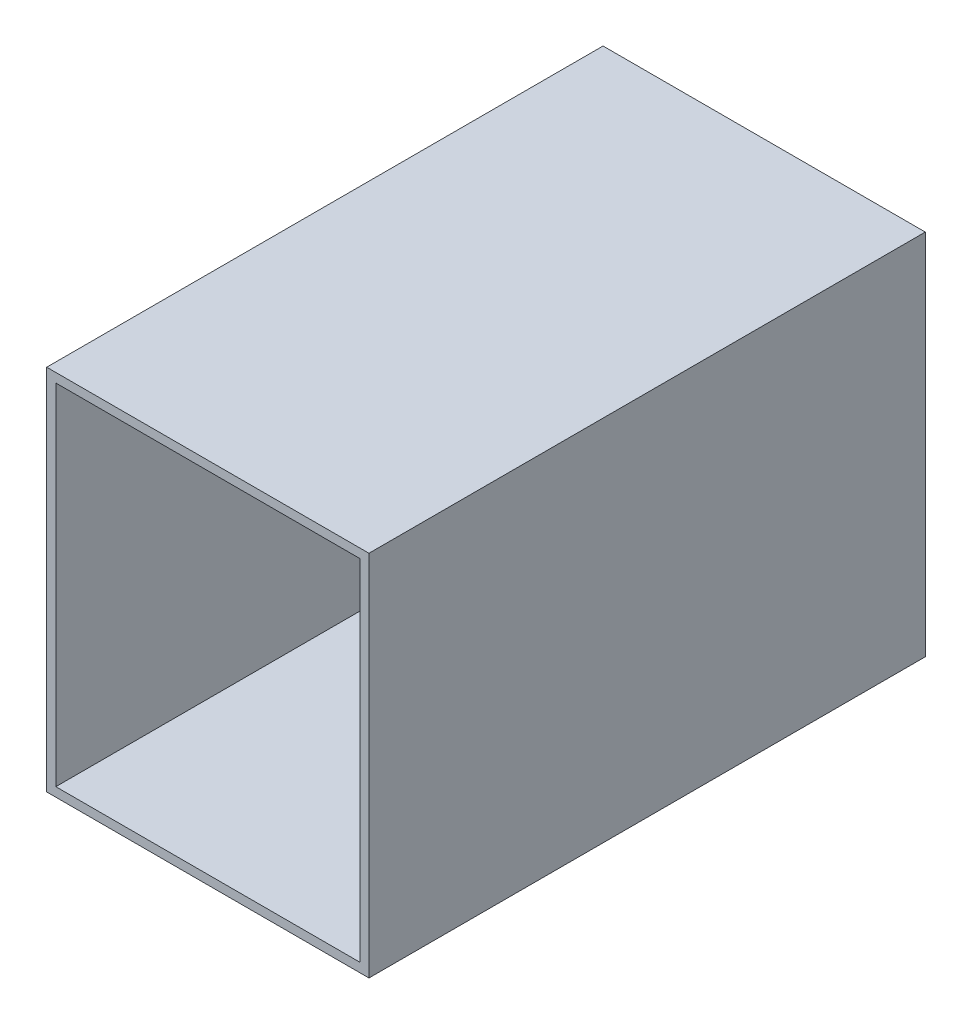
ISO-10303-21;
HEADER;
FILE_DESCRIPTION(('STEP AP214'),'2;1');
FILE_NAME('part.step','',(''),(''),'','','');
FILE_SCHEMA(('AUTOMOTIVE_DESIGN { 1 0 10303 214 1 1 1 1 }'));
ENDSEC;
DATA;
#1=APPLICATION_CONTEXT('core data for automotive mechanical design processes');
#2=APPLICATION_PROTOCOL_DEFINITION('international standard','automotive_design',2000,#1);
#3=PRODUCT_CONTEXT('',#1,'mechanical');
#4=PRODUCT('Part','Part','',(#3));
#5=PRODUCT_RELATED_PRODUCT_CATEGORY('part','',(#4));
#6=PRODUCT_DEFINITION_FORMATION('','',#4);
#7=PRODUCT_DEFINITION_CONTEXT('part definition',#1,'design');
#8=PRODUCT_DEFINITION('design','',#6,#7);
#9=PRODUCT_DEFINITION_SHAPE('','',#8);
#10=(LENGTH_UNIT() NAMED_UNIT(*) SI_UNIT(.MILLI.,.METRE.));
#11=(NAMED_UNIT(*) PLANE_ANGLE_UNIT() SI_UNIT($,.RADIAN.));
#12=(NAMED_UNIT(*) SI_UNIT($,.STERADIAN.) SOLID_ANGLE_UNIT());
#13=UNCERTAINTY_MEASURE_WITH_UNIT(LENGTH_MEASURE(1.E-05),#10,'distance_accuracy_value','');
#14=(GEOMETRIC_REPRESENTATION_CONTEXT(3) GLOBAL_UNCERTAINTY_ASSIGNED_CONTEXT((#13)) GLOBAL_UNIT_ASSIGNED_CONTEXT((#10,
#11,#12)) REPRESENTATION_CONTEXT('',''));
#15=CARTESIAN_POINT('',(0.,0.,0.));
#16=DIRECTION('',(0.,0.,1.));
#17=DIRECTION('',(1.,0.,0.));
#18=AXIS2_PLACEMENT_3D('',#15,#16,#17);
#19=CARTESIAN_POINT('',(0.,121.,183.));
#20=DIRECTION('',(1.,0.,0.));
#21=DIRECTION('',(0.,0.,-1.));
#22=AXIS2_PLACEMENT_3D('',#19,#20,#21);
#23=PLANE('',#22);
#24=DIRECTION('',(0.,-1.,0.));
#25=VECTOR('',#24,1.);
#26=CARTESIAN_POINT('',(0.,121.,0.));
#27=LINE('',#26,#25);
#28=CARTESIAN_POINT('',(0.,121.,0.));
#29=VERTEX_POINT('',#28);
#30=CARTESIAN_POINT('',(0.,0.,0.));
#31=VERTEX_POINT('',#30);
#32=EDGE_CURVE('E153',#29,#31,#27,.T.);
#33=ORIENTED_EDGE('',*,*,#32,.T.);
#34=DIRECTION('',(0.,0.,-1.));
#35=VECTOR('',#34,1.);
#36=CARTESIAN_POINT('',(0.,0.,183.));
#37=LINE('',#36,#35);
#38=CARTESIAN_POINT('',(0.,0.,183.));
#39=VERTEX_POINT('',#38);
#40=EDGE_CURVE('E11',#39,#31,#37,.T.);
#41=ORIENTED_EDGE('',*,*,#40,.F.);
#42=DIRECTION('',(0.,-1.,0.));
#43=VECTOR('',#42,1.);
#44=CARTESIAN_POINT('',(0.,121.,183.));
#45=LINE('',#44,#43);
#46=CARTESIAN_POINT('',(0.,121.,183.));
#47=VERTEX_POINT('',#46);
#48=EDGE_CURVE('E146',#47,#39,#45,.T.);
#49=ORIENTED_EDGE('',*,*,#48,.F.);
#50=DIRECTION('',(0.,0.,-1.));
#51=VECTOR('',#50,1.);
#52=CARTESIAN_POINT('',(0.,121.,183.));
#53=LINE('',#52,#51);
#54=EDGE_CURVE('E152',#47,#29,#53,.T.);
#55=ORIENTED_EDGE('',*,*,#54,.T.);
#56=EDGE_LOOP('',(#33,#41,#49,#55));
#57=FACE_BOUND('',#56,.T.);
#58=ADVANCED_FACE('F39',(#57),#23,.F.);
#59=CARTESIAN_POINT('',(0.,0.,183.));
#60=DIRECTION('',(0.,1.,0.));
#61=DIRECTION('',(0.,0.,1.));
#62=AXIS2_PLACEMENT_3D('',#59,#60,#61);
#63=PLANE('',#62);
#64=DIRECTION('',(1.,0.,0.));
#65=VECTOR('',#64,1.);
#66=CARTESIAN_POINT('',(0.,0.,0.));
#67=LINE('',#66,#65);
#68=CARTESIAN_POINT('',(106.,0.,0.));
#69=VERTEX_POINT('',#68);
#70=EDGE_CURVE('E156',#31,#69,#67,.T.);
#71=ORIENTED_EDGE('',*,*,#70,.T.);
#72=DIRECTION('',(0.,0.,-1.));
#73=VECTOR('',#72,1.);
#74=CARTESIAN_POINT('',(106.,0.,183.));
#75=LINE('',#74,#73);
#76=CARTESIAN_POINT('',(106.,0.,183.));
#77=VERTEX_POINT('',#76);
#78=EDGE_CURVE('E46',#77,#69,#75,.T.);
#79=ORIENTED_EDGE('',*,*,#78,.F.);
#80=DIRECTION('',(1.,0.,0.));
#81=VECTOR('',#80,1.);
#82=CARTESIAN_POINT('',(0.,0.,183.));
#83=LINE('',#82,#81);
#84=EDGE_CURVE('E90',#39,#77,#83,.T.);
#85=ORIENTED_EDGE('',*,*,#84,.F.);
#86=ORIENTED_EDGE('',*,*,#40,.T.);
#87=EDGE_LOOP('',(#71,#79,#85,#86));
#88=FACE_BOUND('',#87,.T.);
#89=ADVANCED_FACE('F185',(#88),#63,.F.);
#90=CARTESIAN_POINT('',(106.,0.,183.));
#91=DIRECTION('',(-1.,0.,0.));
#92=DIRECTION('',(0.,0.,1.));
#93=AXIS2_PLACEMENT_3D('',#90,#91,#92);
#94=PLANE('',#93);
#95=DIRECTION('',(0.,1.,0.));
#96=VECTOR('',#95,1.);
#97=CARTESIAN_POINT('',(106.,0.,0.));
#98=LINE('',#97,#96);
#99=CARTESIAN_POINT('',(106.,121.,0.));
#100=VERTEX_POINT('',#99);
#101=EDGE_CURVE('E158',#69,#100,#98,.T.);
#102=ORIENTED_EDGE('',*,*,#101,.T.);
#103=DIRECTION('',(0.,0.,-1.));
#104=VECTOR('',#103,1.);
#105=CARTESIAN_POINT('',(106.,121.,183.));
#106=LINE('',#105,#104);
#107=CARTESIAN_POINT('',(106.,121.,183.));
#108=VERTEX_POINT('',#107);
#109=EDGE_CURVE('E162',#108,#100,#106,.T.);
#110=ORIENTED_EDGE('',*,*,#109,.F.);
#111=DIRECTION('',(0.,1.,0.));
#112=VECTOR('',#111,1.);
#113=CARTESIAN_POINT('',(106.,0.,183.));
#114=LINE('',#113,#112);
#115=EDGE_CURVE('E149',#77,#108,#114,.T.);
#116=ORIENTED_EDGE('',*,*,#115,.F.);
#117=ORIENTED_EDGE('',*,*,#78,.T.);
#118=EDGE_LOOP('',(#102,#110,#116,#117));
#119=FACE_BOUND('',#118,.T.);
#120=ADVANCED_FACE('F167',(#119),#94,.F.);
#121=CARTESIAN_POINT('',(106.,121.,183.));
#122=DIRECTION('',(0.,-1.,0.));
#123=DIRECTION('',(0.,0.,-1.));
#124=AXIS2_PLACEMENT_3D('',#121,#122,#123);
#125=PLANE('',#124);
#126=DIRECTION('',(-1.,0.,0.));
#127=VECTOR('',#126,1.);
#128=CARTESIAN_POINT('',(106.,121.,0.));
#129=LINE('',#128,#127);
#130=EDGE_CURVE('E83',#100,#29,#129,.T.);
#131=ORIENTED_EDGE('',*,*,#130,.T.);
#132=ORIENTED_EDGE('',*,*,#54,.F.);
#133=DIRECTION('',(-1.,0.,0.));
#134=VECTOR('',#133,1.);
#135=CARTESIAN_POINT('',(106.,121.,183.));
#136=LINE('',#135,#134);
#137=EDGE_CURVE('E62',#108,#47,#136,.T.);
#138=ORIENTED_EDGE('',*,*,#137,.F.);
#139=ORIENTED_EDGE('',*,*,#109,.T.);
#140=EDGE_LOOP('',(#131,#132,#138,#139));
#141=FACE_BOUND('',#140,.T.);
#142=ADVANCED_FACE('F175',(#141),#125,.F.);
#143=CARTESIAN_POINT('',(0.,0.,183.));
#144=DIRECTION('',(0.,0.,1.));
#145=DIRECTION('',(1.,0.,0.));
#146=AXIS2_PLACEMENT_3D('',#143,#144,#145);
#147=PLANE('',#146);
#148=DIRECTION('',(0.,-1.,0.));
#149=VECTOR('',#148,1.);
#150=CARTESIAN_POINT('',(3.,121.,183.));
#151=LINE('',#150,#149);
#152=CARTESIAN_POINT('',(3.,118.,183.));
#153=VERTEX_POINT('',#152);
#154=CARTESIAN_POINT('',(3.,3.,183.));
#155=VERTEX_POINT('',#154);
#156=EDGE_CURVE('E135',#153,#155,#151,.T.);
#157=ORIENTED_EDGE('',*,*,#156,.F.);
#158=DIRECTION('',(-1.,0.,0.));
#159=VECTOR('',#158,1.);
#160=CARTESIAN_POINT('',(106.,118.,183.));
#161=LINE('',#160,#159);
#162=CARTESIAN_POINT('',(103.,118.,183.));
#163=VERTEX_POINT('',#162);
#164=EDGE_CURVE('E144',#163,#153,#161,.T.);
#165=ORIENTED_EDGE('',*,*,#164,.F.);
#166=DIRECTION('',(0.,1.,0.));
#167=VECTOR('',#166,1.);
#168=CARTESIAN_POINT('',(103.,0.,183.));
#169=LINE('',#168,#167);
#170=CARTESIAN_POINT('',(103.,3.,183.));
#171=VERTEX_POINT('',#170);
#172=EDGE_CURVE('E142',#171,#163,#169,.T.);
#173=ORIENTED_EDGE('',*,*,#172,.F.);
#174=DIRECTION('',(1.,0.,0.));
#175=VECTOR('',#174,1.);
#176=CARTESIAN_POINT('',(0.,3.,183.));
#177=LINE('',#176,#175);
#178=EDGE_CURVE('E127',#155,#171,#177,.T.);
#179=ORIENTED_EDGE('',*,*,#178,.F.);
#180=EDGE_LOOP('',(#157,#165,#173,#179));
#181=FACE_BOUND('',#180,.T.);
#182=ORIENTED_EDGE('',*,*,#48,.T.);
#183=ORIENTED_EDGE('',*,*,#84,.T.);
#184=ORIENTED_EDGE('',*,*,#115,.T.);
#185=ORIENTED_EDGE('',*,*,#137,.T.);
#186=EDGE_LOOP('',(#182,#183,#184,#185));
#187=FACE_BOUND('',#186,.T.);
#188=ADVANCED_FACE('F177',(#181,#187),#147,.T.);
#189=CARTESIAN_POINT('',(0.,0.,0.));
#190=DIRECTION('',(0.,0.,1.));
#191=DIRECTION('',(1.,0.,0.));
#192=AXIS2_PLACEMENT_3D('',#189,#190,#191);
#193=PLANE('',#192);
#194=ORIENTED_EDGE('',*,*,#32,.F.);
#195=ORIENTED_EDGE('',*,*,#130,.F.);
#196=ORIENTED_EDGE('',*,*,#101,.F.);
#197=ORIENTED_EDGE('',*,*,#70,.F.);
#198=EDGE_LOOP('',(#194,#195,#196,#197));
#199=FACE_BOUND('',#198,.T.);
#200=ADVANCED_FACE('F171',(#199),#193,.F.);
#201=CARTESIAN_POINT('',(3.,121.,183.));
#202=DIRECTION('',(1.,0.,0.));
#203=DIRECTION('',(0.,0.,-1.));
#204=AXIS2_PLACEMENT_3D('',#201,#202,#203);
#205=PLANE('',#204);
#206=DIRECTION('',(0.,-1.,0.));
#207=VECTOR('',#206,1.);
#208=CARTESIAN_POINT('',(3.,121.,3.));
#209=LINE('',#208,#207);
#210=CARTESIAN_POINT('',(3.,118.,3.));
#211=VERTEX_POINT('',#210);
#212=CARTESIAN_POINT('',(3.,3.,3.));
#213=VERTEX_POINT('',#212);
#214=EDGE_CURVE('E118',#211,#213,#209,.T.);
#215=ORIENTED_EDGE('',*,*,#214,.F.);
#216=DIRECTION('',(0.,0.,-1.));
#217=VECTOR('',#216,1.);
#218=CARTESIAN_POINT('',(3.,118.,183.));
#219=LINE('',#218,#217);
#220=EDGE_CURVE('E138',#153,#211,#219,.T.);
#221=ORIENTED_EDGE('',*,*,#220,.F.);
#222=ORIENTED_EDGE('',*,*,#156,.T.);
#223=DIRECTION('',(0.,0.,-1.));
#224=VECTOR('',#223,1.);
#225=CARTESIAN_POINT('',(3.,3.,183.));
#226=LINE('',#225,#224);
#227=EDGE_CURVE('E130',#155,#213,#226,.T.);
#228=ORIENTED_EDGE('',*,*,#227,.T.);
#229=EDGE_LOOP('',(#215,#221,#222,#228));
#230=FACE_BOUND('',#229,.T.);
#231=ADVANCED_FACE('F214',(#230),#205,.T.);
#232=CARTESIAN_POINT('',(0.,3.,183.));
#233=DIRECTION('',(0.,1.,0.));
#234=DIRECTION('',(0.,0.,1.));
#235=AXIS2_PLACEMENT_3D('',#232,#233,#234);
#236=PLANE('',#235);
#237=DIRECTION('',(1.,0.,0.));
#238=VECTOR('',#237,1.);
#239=CARTESIAN_POINT('',(0.,3.,3.));
#240=LINE('',#239,#238);
#241=CARTESIAN_POINT('',(103.,3.,3.));
#242=VERTEX_POINT('',#241);
#243=EDGE_CURVE('E112',#213,#242,#240,.T.);
#244=ORIENTED_EDGE('',*,*,#243,.F.);
#245=ORIENTED_EDGE('',*,*,#227,.F.);
#246=ORIENTED_EDGE('',*,*,#178,.T.);
#247=DIRECTION('',(0.,0.,-1.));
#248=VECTOR('',#247,1.);
#249=CARTESIAN_POINT('',(103.,3.,183.));
#250=LINE('',#249,#248);
#251=EDGE_CURVE('E124',#171,#242,#250,.T.);
#252=ORIENTED_EDGE('',*,*,#251,.T.);
#253=EDGE_LOOP('',(#244,#245,#246,#252));
#254=FACE_BOUND('',#253,.T.);
#255=ADVANCED_FACE('F125',(#254),#236,.T.);
#256=CARTESIAN_POINT('',(103.,0.,183.));
#257=DIRECTION('',(-1.,0.,0.));
#258=DIRECTION('',(0.,0.,1.));
#259=AXIS2_PLACEMENT_3D('',#256,#257,#258);
#260=PLANE('',#259);
#261=DIRECTION('',(0.,1.,0.));
#262=VECTOR('',#261,1.);
#263=CARTESIAN_POINT('',(103.,0.,3.));
#264=LINE('',#263,#262);
#265=CARTESIAN_POINT('',(103.,118.,3.));
#266=VERTEX_POINT('',#265);
#267=EDGE_CURVE('E116',#242,#266,#264,.T.);
#268=ORIENTED_EDGE('',*,*,#267,.F.);
#269=ORIENTED_EDGE('',*,*,#251,.F.);
#270=ORIENTED_EDGE('',*,*,#172,.T.);
#271=DIRECTION('',(0.,0.,-1.));
#272=VECTOR('',#271,1.);
#273=CARTESIAN_POINT('',(103.,118.,183.));
#274=LINE('',#273,#272);
#275=EDGE_CURVE('E53',#163,#266,#274,.T.);
#276=ORIENTED_EDGE('',*,*,#275,.T.);
#277=EDGE_LOOP('',(#268,#269,#270,#276));
#278=FACE_BOUND('',#277,.T.);
#279=ADVANCED_FACE('F132',(#278),#260,.T.);
#280=CARTESIAN_POINT('',(106.,118.,183.));
#281=DIRECTION('',(0.,-1.,0.));
#282=DIRECTION('',(0.,0.,-1.));
#283=AXIS2_PLACEMENT_3D('',#280,#281,#282);
#284=PLANE('',#283);
#285=DIRECTION('',(-1.,0.,0.));
#286=VECTOR('',#285,1.);
#287=CARTESIAN_POINT('',(106.,118.,3.));
#288=LINE('',#287,#286);
#289=EDGE_CURVE('E133',#266,#211,#288,.T.);
#290=ORIENTED_EDGE('',*,*,#289,.F.);
#291=ORIENTED_EDGE('',*,*,#275,.F.);
#292=ORIENTED_EDGE('',*,*,#164,.T.);
#293=ORIENTED_EDGE('',*,*,#220,.T.);
#294=EDGE_LOOP('',(#290,#291,#292,#293));
#295=FACE_BOUND('',#294,.T.);
#296=ADVANCED_FACE('F248',(#295),#284,.T.);
#297=CARTESIAN_POINT('',(0.,0.,3.));
#298=DIRECTION('',(0.,0.,1.));
#299=DIRECTION('',(1.,0.,0.));
#300=AXIS2_PLACEMENT_3D('',#297,#298,#299);
#301=PLANE('',#300);
#302=ORIENTED_EDGE('',*,*,#214,.T.);
#303=ORIENTED_EDGE('',*,*,#243,.T.);
#304=ORIENTED_EDGE('',*,*,#267,.T.);
#305=ORIENTED_EDGE('',*,*,#289,.T.);
#306=EDGE_LOOP('',(#302,#303,#304,#305));
#307=FACE_BOUND('',#306,.T.);
#308=ADVANCED_FACE('F114',(#307),#301,.T.);
#309=CLOSED_SHELL('',(#58,#89,#120,#142,#188,#200,#231,#255,#279,#296,#308));
#310=MANIFOLD_SOLID_BREP('B2',#309);
#311=ADVANCED_BREP_SHAPE_REPRESENTATION('',(#18,#310),#14);
#312=SHAPE_DEFINITION_REPRESENTATION(#9,#311);
ENDSEC;
END-ISO-10303-21;
